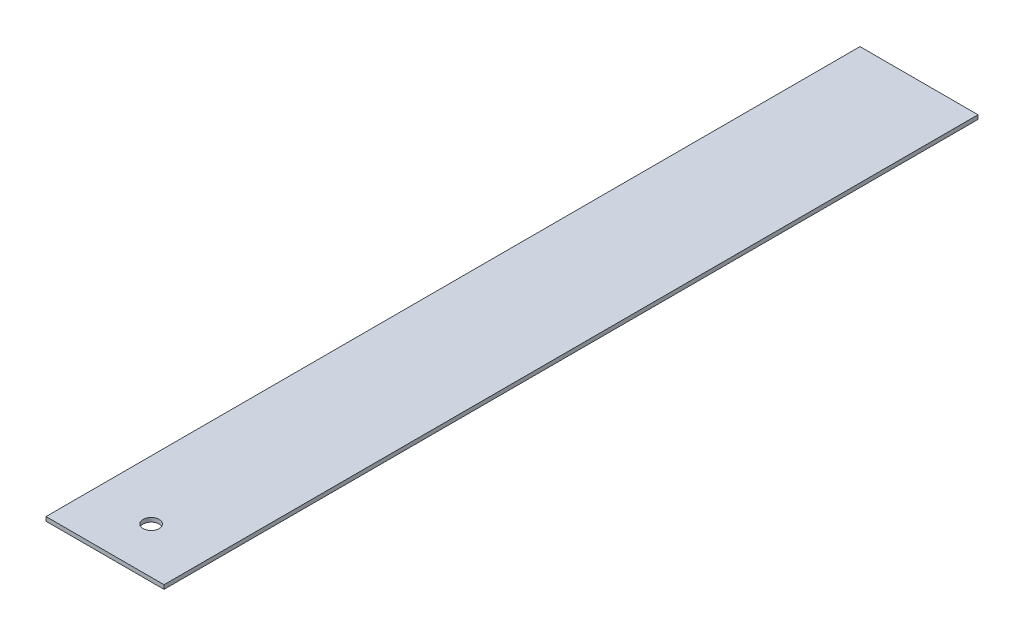
ISO-10303-21;
HEADER;
FILE_DESCRIPTION(('STEP AP214'),'2;1');
FILE_NAME('part.step','',(''),(''),'','','');
FILE_SCHEMA(('AUTOMOTIVE_DESIGN { 1 0 10303 214 1 1 1 1 }'));
ENDSEC;
DATA;
#1=APPLICATION_CONTEXT('core data for automotive mechanical design processes');
#2=APPLICATION_PROTOCOL_DEFINITION('international standard','automotive_design',2000,#1);
#3=PRODUCT_CONTEXT('',#1,'mechanical');
#4=PRODUCT('Part','Part','',(#3));
#5=PRODUCT_RELATED_PRODUCT_CATEGORY('part','',(#4));
#6=PRODUCT_DEFINITION_FORMATION('','',#4);
#7=PRODUCT_DEFINITION_CONTEXT('part definition',#1,'design');
#8=PRODUCT_DEFINITION('design','',#6,#7);
#9=PRODUCT_DEFINITION_SHAPE('','',#8);
#10=(LENGTH_UNIT() NAMED_UNIT(*) SI_UNIT(.MILLI.,.METRE.));
#11=(NAMED_UNIT(*) PLANE_ANGLE_UNIT() SI_UNIT($,.RADIAN.));
#12=(NAMED_UNIT(*) SI_UNIT($,.STERADIAN.) SOLID_ANGLE_UNIT());
#13=UNCERTAINTY_MEASURE_WITH_UNIT(LENGTH_MEASURE(1.E-05),#10,'distance_accuracy_value','');
#14=(GEOMETRIC_REPRESENTATION_CONTEXT(3) GLOBAL_UNCERTAINTY_ASSIGNED_CONTEXT((#13)) GLOBAL_UNIT_ASSIGNED_CONTEXT((#10,
#11,#12)) REPRESENTATION_CONTEXT('',''));
#15=CARTESIAN_POINT('',(0.,0.,0.));
#16=DIRECTION('',(0.,0.,1.));
#17=DIRECTION('',(1.,0.,0.));
#18=AXIS2_PLACEMENT_3D('',#15,#16,#17);
#19=CARTESIAN_POINT('',(0.,0.762,0.));
#20=DIRECTION('',(1.,0.,0.));
#21=DIRECTION('',(0.,0.,-1.));
#22=AXIS2_PLACEMENT_3D('',#19,#20,#21);
#23=PLANE('',#22);
#24=DIRECTION('',(0.,0.,1.));
#25=VECTOR('',#24,1.);
#26=CARTESIAN_POINT('',(0.,0.,0.));
#27=LINE('',#26,#25);
#28=CARTESIAN_POINT('',(0.,0.,-152.4));
#29=VERTEX_POINT('',#28);
#30=CARTESIAN_POINT('',(0.,0.,0.));
#31=VERTEX_POINT('',#30);
#32=EDGE_CURVE('E107',#29,#31,#27,.T.);
#33=ORIENTED_EDGE('',*,*,#32,.T.);
#34=DIRECTION('',(0.,-1.,0.));
#35=VECTOR('',#34,1.);
#36=CARTESIAN_POINT('',(0.,0.762,0.));
#37=LINE('',#36,#35);
#38=CARTESIAN_POINT('',(0.,0.762,0.));
#39=VERTEX_POINT('',#38);
#40=EDGE_CURVE('E11',#39,#31,#37,.T.);
#41=ORIENTED_EDGE('',*,*,#40,.F.);
#42=DIRECTION('',(0.,0.,1.));
#43=VECTOR('',#42,1.);
#44=CARTESIAN_POINT('',(0.,0.762,0.));
#45=LINE('',#44,#43);
#46=CARTESIAN_POINT('',(0.,0.762,-152.4));
#47=VERTEX_POINT('',#46);
#48=EDGE_CURVE('E95',#47,#39,#45,.T.);
#49=ORIENTED_EDGE('',*,*,#48,.F.);
#50=DIRECTION('',(0.,-1.,0.));
#51=VECTOR('',#50,1.);
#52=CARTESIAN_POINT('',(0.,0.762,-152.4));
#53=LINE('',#52,#51);
#54=EDGE_CURVE('E103',#47,#29,#53,.T.);
#55=ORIENTED_EDGE('',*,*,#54,.T.);
#56=EDGE_LOOP('',(#33,#41,#49,#55));
#57=FACE_BOUND('',#56,.T.);
#58=ADVANCED_FACE('F44',(#57),#23,.F.);
#59=CARTESIAN_POINT('',(0.,0.762,0.));
#60=DIRECTION('',(0.,0.,-1.));
#61=DIRECTION('',(-1.,0.,0.));
#62=AXIS2_PLACEMENT_3D('',#59,#60,#61);
#63=PLANE('',#62);
#64=DIRECTION('',(1.,0.,0.));
#65=VECTOR('',#64,1.);
#66=CARTESIAN_POINT('',(0.,0.,0.));
#67=LINE('',#66,#65);
#68=CARTESIAN_POINT('',(22.098,0.,0.));
#69=VERTEX_POINT('',#68);
#70=EDGE_CURVE('E99',#31,#69,#67,.T.);
#71=ORIENTED_EDGE('',*,*,#70,.T.);
#72=DIRECTION('',(0.,-1.,0.));
#73=VECTOR('',#72,1.);
#74=CARTESIAN_POINT('',(22.098,0.762,0.));
#75=LINE('',#74,#73);
#76=CARTESIAN_POINT('',(22.098,0.762,0.));
#77=VERTEX_POINT('',#76);
#78=EDGE_CURVE('E52',#77,#69,#75,.T.);
#79=ORIENTED_EDGE('',*,*,#78,.F.);
#80=DIRECTION('',(1.,0.,0.));
#81=VECTOR('',#80,1.);
#82=CARTESIAN_POINT('',(0.,0.762,0.));
#83=LINE('',#82,#81);
#84=EDGE_CURVE('E90',#39,#77,#83,.T.);
#85=ORIENTED_EDGE('',*,*,#84,.F.);
#86=ORIENTED_EDGE('',*,*,#40,.T.);
#87=EDGE_LOOP('',(#71,#79,#85,#86));
#88=FACE_BOUND('',#87,.T.);
#89=ADVANCED_FACE('F98',(#88),#63,.F.);
#90=CARTESIAN_POINT('',(22.098,0.762,0.));
#91=DIRECTION('',(-1.,0.,0.));
#92=DIRECTION('',(0.,0.,1.));
#93=AXIS2_PLACEMENT_3D('',#90,#91,#92);
#94=PLANE('',#93);
#95=DIRECTION('',(0.,0.,-1.));
#96=VECTOR('',#95,1.);
#97=CARTESIAN_POINT('',(22.098,0.,0.));
#98=LINE('',#97,#96);
#99=CARTESIAN_POINT('',(22.098,0.,-152.4));
#100=VERTEX_POINT('',#99);
#101=EDGE_CURVE('E77',#69,#100,#98,.T.);
#102=ORIENTED_EDGE('',*,*,#101,.T.);
#103=DIRECTION('',(0.,-1.,0.));
#104=VECTOR('',#103,1.);
#105=CARTESIAN_POINT('',(22.098,0.762,-152.4));
#106=LINE('',#105,#104);
#107=CARTESIAN_POINT('',(22.098,0.762,-152.4));
#108=VERTEX_POINT('',#107);
#109=EDGE_CURVE('E100',#108,#100,#106,.T.);
#110=ORIENTED_EDGE('',*,*,#109,.F.);
#111=DIRECTION('',(0.,0.,-1.));
#112=VECTOR('',#111,1.);
#113=CARTESIAN_POINT('',(22.098,0.762,0.));
#114=LINE('',#113,#112);
#115=EDGE_CURVE('E93',#77,#108,#114,.T.);
#116=ORIENTED_EDGE('',*,*,#115,.F.);
#117=ORIENTED_EDGE('',*,*,#78,.T.);
#118=EDGE_LOOP('',(#102,#110,#116,#117));
#119=FACE_BOUND('',#118,.T.);
#120=ADVANCED_FACE('F101',(#119),#94,.F.);
#121=CARTESIAN_POINT('',(0.,0.762,-152.4));
#122=DIRECTION('',(0.,0.,1.));
#123=DIRECTION('',(1.,0.,0.));
#124=AXIS2_PLACEMENT_3D('',#121,#122,#123);
#125=PLANE('',#124);
#126=DIRECTION('',(-1.,0.,0.));
#127=VECTOR('',#126,1.);
#128=CARTESIAN_POINT('',(0.,0.,-152.4));
#129=LINE('',#128,#127);
#130=EDGE_CURVE('E83',#100,#29,#129,.T.);
#131=ORIENTED_EDGE('',*,*,#130,.T.);
#132=ORIENTED_EDGE('',*,*,#54,.F.);
#133=DIRECTION('',(-1.,0.,0.));
#134=VECTOR('',#133,1.);
#135=CARTESIAN_POINT('',(0.,0.762,-152.4));
#136=LINE('',#135,#134);
#137=EDGE_CURVE('E60',#108,#47,#136,.T.);
#138=ORIENTED_EDGE('',*,*,#137,.F.);
#139=ORIENTED_EDGE('',*,*,#109,.T.);
#140=EDGE_LOOP('',(#131,#132,#138,#139));
#141=FACE_BOUND('',#140,.T.);
#142=ADVANCED_FACE('F115',(#141),#125,.F.);
#143=CARTESIAN_POINT('',(0.,0.762,0.));
#144=DIRECTION('',(0.,-1.,0.));
#145=DIRECTION('',(0.,0.,-1.));
#146=AXIS2_PLACEMENT_3D('',#143,#144,#145);
#147=PLANE('',#146);
#148=CARTESIAN_POINT('',(11.049,0.762,-8.636));
#149=DIRECTION('',(0.,1.,0.));
#150=DIRECTION('',(0.,0.,1.));
#151=AXIS2_PLACEMENT_3D('',#148,#149,#150);
#152=CIRCLE('',#151,1.5);
#153=CARTESIAN_POINT('',(11.049,0.762,-7.136));
#154=VERTEX_POINT('',#153);
#155=EDGE_CURVE('E110',#154,#154,#152,.T.);
#156=ORIENTED_EDGE('',*,*,#155,.F.);
#157=EDGE_LOOP('',(#156));
#158=FACE_BOUND('',#157,.T.);
#159=ORIENTED_EDGE('',*,*,#48,.T.);
#160=ORIENTED_EDGE('',*,*,#84,.T.);
#161=ORIENTED_EDGE('',*,*,#115,.T.);
#162=ORIENTED_EDGE('',*,*,#137,.T.);
#163=EDGE_LOOP('',(#159,#160,#161,#162));
#164=FACE_BOUND('',#163,.T.);
#165=ADVANCED_FACE('F91',(#158,#164),#147,.F.);
#166=CARTESIAN_POINT('',(0.,0.,0.));
#167=DIRECTION('',(0.,-1.,0.));
#168=DIRECTION('',(0.,0.,-1.));
#169=AXIS2_PLACEMENT_3D('',#166,#167,#168);
#170=PLANE('',#169);
#171=CARTESIAN_POINT('',(11.049,0.,-8.636));
#172=DIRECTION('',(0.,-1.,0.));
#173=DIRECTION('',(0.,0.,-1.));
#174=AXIS2_PLACEMENT_3D('',#171,#172,#173);
#175=CIRCLE('',#174,1.5);
#176=CARTESIAN_POINT('',(11.049,0.,-7.136));
#177=VERTEX_POINT('',#176);
#178=EDGE_CURVE('E121',#177,#177,#175,.F.);
#179=ORIENTED_EDGE('',*,*,#178,.T.);
#180=EDGE_LOOP('',(#179));
#181=FACE_BOUND('',#180,.T.);
#182=ORIENTED_EDGE('',*,*,#32,.F.);
#183=ORIENTED_EDGE('',*,*,#130,.F.);
#184=ORIENTED_EDGE('',*,*,#101,.F.);
#185=ORIENTED_EDGE('',*,*,#70,.F.);
#186=EDGE_LOOP('',(#182,#183,#184,#185));
#187=FACE_BOUND('',#186,.T.);
#188=ADVANCED_FACE('F118',(#181,#187),#170,.T.);
#189=CARTESIAN_POINT('',(11.049,-0.00100000000000002,-8.636));
#190=DIRECTION('',(0.,1.,0.));
#191=DIRECTION('',(0.,0.,1.));
#192=AXIS2_PLACEMENT_3D('',#189,#190,#191);
#193=CYLINDRICAL_SURFACE('',#192,1.5);
#194=CARTESIAN_POINT('',(11.049,0.,-7.136));
#195=CARTESIAN_POINT('',(11.049,0.00793749999999999,-7.136));
#196=CARTESIAN_POINT('',(11.049,0.015875,-7.136));
#197=CARTESIAN_POINT('',(11.049,0.03175,-7.136));
#198=CARTESIAN_POINT('',(11.049,0.0396875,-7.136));
#199=CARTESIAN_POINT('',(11.049,0.0555625,-7.136));
#200=CARTESIAN_POINT('',(11.049,0.0635,-7.136));
#201=CARTESIAN_POINT('',(11.049,0.079375,-7.136));
#202=CARTESIAN_POINT('',(11.049,0.0873125,-7.136));
#203=CARTESIAN_POINT('',(11.049,0.1031875,-7.136));
#204=CARTESIAN_POINT('',(11.049,0.111125,-7.136));
#205=CARTESIAN_POINT('',(11.049,0.127,-7.136));
#206=CARTESIAN_POINT('',(11.049,0.1349375,-7.136));
#207=CARTESIAN_POINT('',(11.049,0.1508125,-7.136));
#208=CARTESIAN_POINT('',(11.049,0.15875,-7.136));
#209=CARTESIAN_POINT('',(11.049,0.174625,-7.136));
#210=CARTESIAN_POINT('',(11.049,0.1825625,-7.136));
#211=CARTESIAN_POINT('',(11.049,0.1984375,-7.136));
#212=CARTESIAN_POINT('',(11.049,0.206375,-7.136));
#213=CARTESIAN_POINT('',(11.049,0.22225,-7.136));
#214=CARTESIAN_POINT('',(11.049,0.2301875,-7.136));
#215=CARTESIAN_POINT('',(11.049,0.2460625,-7.136));
#216=CARTESIAN_POINT('',(11.049,0.254,-7.136));
#217=CARTESIAN_POINT('',(11.049,0.269875,-7.136));
#218=CARTESIAN_POINT('',(11.049,0.2778125,-7.136));
#219=CARTESIAN_POINT('',(11.049,0.2936875,-7.136));
#220=CARTESIAN_POINT('',(11.049,0.301625,-7.136));
#221=CARTESIAN_POINT('',(11.049,0.3175,-7.136));
#222=CARTESIAN_POINT('',(11.049,0.3254375,-7.136));
#223=CARTESIAN_POINT('',(11.049,0.3413125,-7.136));
#224=CARTESIAN_POINT('',(11.049,0.34925,-7.136));
#225=CARTESIAN_POINT('',(11.049,0.365125,-7.136));
#226=CARTESIAN_POINT('',(11.049,0.3730625,-7.136));
#227=CARTESIAN_POINT('',(11.049,0.3889375,-7.136));
#228=CARTESIAN_POINT('',(11.049,0.396875,-7.136));
#229=CARTESIAN_POINT('',(11.049,0.41275,-7.136));
#230=CARTESIAN_POINT('',(11.049,0.4206875,-7.136));
#231=CARTESIAN_POINT('',(11.049,0.4365625,-7.136));
#232=CARTESIAN_POINT('',(11.049,0.4445,-7.136));
#233=CARTESIAN_POINT('',(11.049,0.460375,-7.136));
#234=CARTESIAN_POINT('',(11.049,0.4683125,-7.136));
#235=CARTESIAN_POINT('',(11.049,0.4841875,-7.136));
#236=CARTESIAN_POINT('',(11.049,0.492125,-7.136));
#237=CARTESIAN_POINT('',(11.049,0.508,-7.136));
#238=CARTESIAN_POINT('',(11.049,0.5159375,-7.136));
#239=CARTESIAN_POINT('',(11.049,0.5318125,-7.136));
#240=CARTESIAN_POINT('',(11.049,0.53975,-7.136));
#241=CARTESIAN_POINT('',(11.049,0.555625,-7.136));
#242=CARTESIAN_POINT('',(11.049,0.5635625,-7.136));
#243=CARTESIAN_POINT('',(11.049,0.5794375,-7.136));
#244=CARTESIAN_POINT('',(11.049,0.587375,-7.136));
#245=CARTESIAN_POINT('',(11.049,0.60325,-7.136));
#246=CARTESIAN_POINT('',(11.049,0.6111875,-7.136));
#247=CARTESIAN_POINT('',(11.049,0.6270625,-7.136));
#248=CARTESIAN_POINT('',(11.049,0.635,-7.136));
#249=CARTESIAN_POINT('',(11.049,0.650875,-7.136));
#250=CARTESIAN_POINT('',(11.049,0.6588125,-7.136));
#251=CARTESIAN_POINT('',(11.049,0.6746875,-7.136));
#252=CARTESIAN_POINT('',(11.049,0.682625,-7.136));
#253=CARTESIAN_POINT('',(11.049,0.6985,-7.136));
#254=CARTESIAN_POINT('',(11.049,0.7064375,-7.136));
#255=CARTESIAN_POINT('',(11.049,0.7223125,-7.136));
#256=CARTESIAN_POINT('',(11.049,0.73025,-7.136));
#257=CARTESIAN_POINT('',(11.049,0.746125,-7.136));
#258=CARTESIAN_POINT('',(11.049,0.7540625,-7.136));
#259=CARTESIAN_POINT('',(11.049,0.762,-7.136));
#260=B_SPLINE_CURVE_WITH_KNOTS('',3,(#194,#195,#196,#197,#198,#199,#200,#201,#202,#203,#204,
#205,#206,#207,#208,#209,#210,#211,#212,#213,#214,#215,#216,#217,#218,#219,#220,#221,#222,#223,
#224,#225,#226,#227,#228,#229,#230,#231,#232,#233,#234,#235,#236,#237,#238,#239,#240,#241,#242,
#243,#244,#245,#246,#247,#248,#249,#250,#251,#252,#253,#254,#255,#256,#257,#258,#259),
.UNSPECIFIED.,.F.,.F.,(4,2,2,2,2,2,2,2,2,2,2,2,2,2,2,2,2,2,2,2,2,2,2,2,2,2,2,2,2,2,2,2,4),(0.,
0.0238125,0.047625,0.0714375,0.09525,0.1190625,0.142875,0.1666875,0.1905,0.2143125,0.238125,
0.2619375,0.28575,0.3095625,0.333375,0.3571875,0.381,0.4048125,0.428625,0.4524375,0.47625,
0.5000625,0.523875,0.5476875,0.5715,0.5953125,0.619125,0.6429375,0.66675,0.6905625,0.714375,
0.7381875,0.762),.UNSPECIFIED.);
#261=EDGE_CURVE('BSEAM127',#177,#154,#260,.T.);
#262=ORIENTED_EDGE('',*,*,#178,.F.);
#263=ORIENTED_EDGE('',*,*,#155,.T.);
#264=ORIENTED_EDGE('',*,*,#261,.T.);
#265=ORIENTED_EDGE('',*,*,#261,.F.);
#266=EDGE_LOOP('',(#262,#264,#263,#265));
#267=FACE_BOUND('',#266,.T.);
#268=ADVANCED_FACE('F127',(#267),#193,.F.);
#269=CLOSED_SHELL('',(#58,#89,#120,#142,#165,#188,#268));
#270=MANIFOLD_SOLID_BREP('B2',#269);
#271=ADVANCED_BREP_SHAPE_REPRESENTATION('',(#18,#270),#14);
#272=SHAPE_DEFINITION_REPRESENTATION(#9,#271);
ENDSEC;
END-ISO-10303-21;
